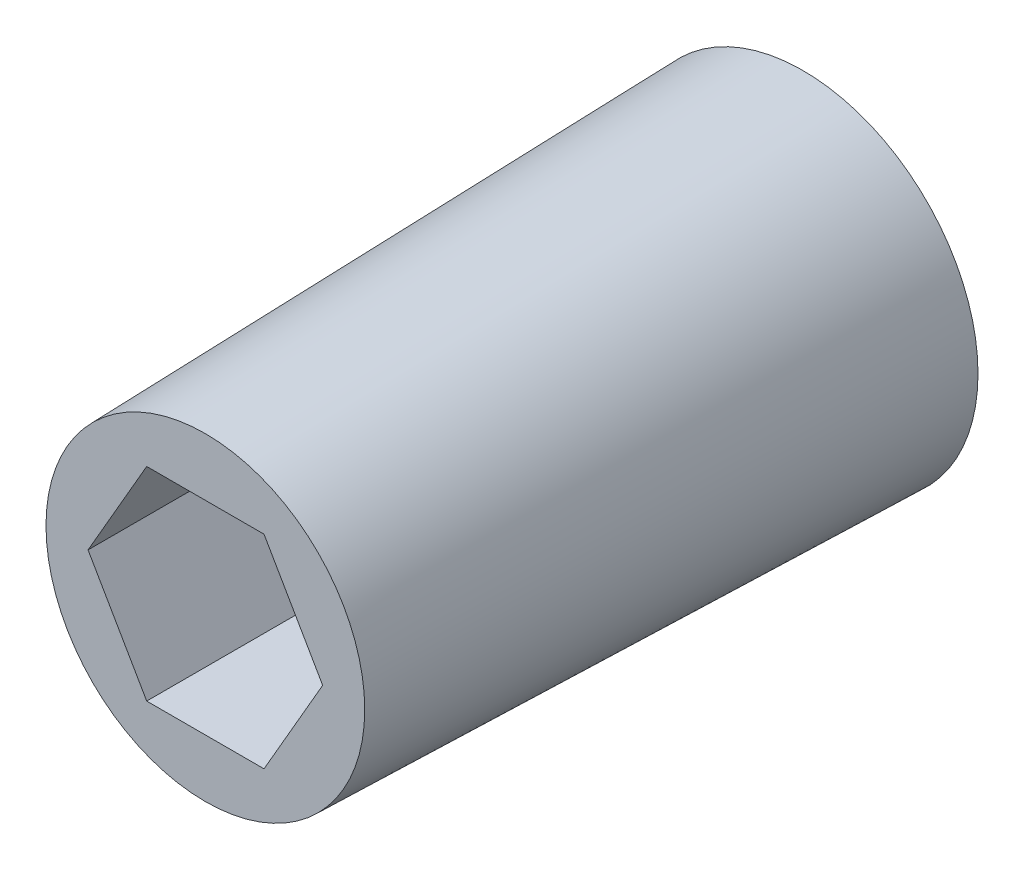
ISO-10303-21;
HEADER;
FILE_DESCRIPTION(('STEP AP214'),'2;1');
FILE_NAME('part.step','',(''),(''),'','','');
FILE_SCHEMA(('AUTOMOTIVE_DESIGN { 1 0 10303 214 1 1 1 1 }'));
ENDSEC;
DATA;
#1=APPLICATION_CONTEXT('core data for automotive mechanical design processes');
#2=APPLICATION_PROTOCOL_DEFINITION('international standard','automotive_design',2000,#1);
#3=PRODUCT_CONTEXT('',#1,'mechanical');
#4=PRODUCT('Part','Part','',(#3));
#5=PRODUCT_RELATED_PRODUCT_CATEGORY('part','',(#4));
#6=PRODUCT_DEFINITION_FORMATION('','',#4);
#7=PRODUCT_DEFINITION_CONTEXT('part definition',#1,'design');
#8=PRODUCT_DEFINITION('design','',#6,#7);
#9=PRODUCT_DEFINITION_SHAPE('','',#8);
#10=(LENGTH_UNIT() NAMED_UNIT(*) SI_UNIT(.MILLI.,.METRE.));
#11=(NAMED_UNIT(*) PLANE_ANGLE_UNIT() SI_UNIT($,.RADIAN.));
#12=(NAMED_UNIT(*) SI_UNIT($,.STERADIAN.) SOLID_ANGLE_UNIT());
#13=UNCERTAINTY_MEASURE_WITH_UNIT(LENGTH_MEASURE(1.E-05),#10,'distance_accuracy_value','');
#14=(GEOMETRIC_REPRESENTATION_CONTEXT(3) GLOBAL_UNCERTAINTY_ASSIGNED_CONTEXT((#13)) GLOBAL_UNIT_ASSIGNED_CONTEXT((#10,
#11,#12)) REPRESENTATION_CONTEXT('',''));
#15=CARTESIAN_POINT('',(0.,0.,0.));
#16=DIRECTION('',(0.,0.,1.));
#17=DIRECTION('',(1.,0.,0.));
#18=AXIS2_PLACEMENT_3D('',#15,#16,#17);
#19=CARTESIAN_POINT('',(0.,0.,7.5));
#20=DIRECTION('',(0.,0.,-1.));
#21=DIRECTION('',(-1.,0.,0.));
#22=AXIS2_PLACEMENT_3D('',#19,#20,#21);
#23=CONICAL_SURFACE('',#22,3.99999999999721,0.026179938749972);
#24=CARTESIAN_POINT('',(0.,0.,-7.5));
#25=DIRECTION('',(0.,0.,1.));
#26=DIRECTION('',(1.,0.,0.));
#27=AXIS2_PLACEMENT_3D('',#24,#25,#26);
#28=CIRCLE('',#27,4.39278882308556);
#29=CARTESIAN_POINT('',(4.39278882308556,0.,-7.5));
#30=VERTEX_POINT('',#29);
#31=EDGE_CURVE('E11',#30,#30,#28,.T.);
#32=ORIENTED_EDGE('',*,*,#31,.T.);
#33=EDGE_LOOP('',(#32));
#34=FACE_BOUND('',#33,.T.);
#35=CARTESIAN_POINT('',(0.,0.,7.5));
#36=DIRECTION('',(0.,0.,1.));
#37=DIRECTION('',(1.,0.,0.));
#38=AXIS2_PLACEMENT_3D('',#35,#36,#37);
#39=CIRCLE('',#38,3.99999999999721);
#40=CARTESIAN_POINT('',(3.99999999999721,0.,7.5));
#41=VERTEX_POINT('',#40);
#42=EDGE_CURVE('E40',#41,#41,#39,.T.);
#43=ORIENTED_EDGE('',*,*,#42,.F.);
#44=EDGE_LOOP('',(#43));
#45=FACE_BOUND('',#44,.T.);
#46=ADVANCED_FACE('F33',(#34,#45),#23,.T.);
#47=CARTESIAN_POINT('',(4.39278882308556,0.,-7.5));
#48=DIRECTION('',(0.,0.,-1.));
#49=DIRECTION('',(-1.,0.,0.));
#50=AXIS2_PLACEMENT_3D('',#47,#48,#49);
#51=PLANE('',#50);
#52=DIRECTION('',(0.5,-0.866025403784439,0.));
#53=VECTOR('',#52,1.);
#54=CARTESIAN_POINT('',(1.47224318643355,2.55,-7.5));
#55=LINE('',#54,#53);
#56=CARTESIAN_POINT('',(1.47224318643355,2.55,-7.5));
#57=VERTEX_POINT('',#56);
#58=CARTESIAN_POINT('',(2.94448637286709,0.,-7.5));
#59=VERTEX_POINT('',#58);
#60=EDGE_CURVE('E47',#57,#59,#55,.T.);
#61=ORIENTED_EDGE('',*,*,#60,.F.);
#62=DIRECTION('',(1.,0.,0.));
#63=VECTOR('',#62,1.);
#64=CARTESIAN_POINT('',(-1.47224318643355,2.55,-7.5));
#65=LINE('',#64,#63);
#66=CARTESIAN_POINT('',(-1.47224318643355,2.55,-7.5));
#67=VERTEX_POINT('',#66);
#68=EDGE_CURVE('E104',#67,#57,#65,.T.);
#69=ORIENTED_EDGE('',*,*,#68,.F.);
#70=DIRECTION('',(0.5,0.866025403784439,0.));
#71=VECTOR('',#70,1.);
#72=CARTESIAN_POINT('',(-2.94448637286709,0.,-7.5));
#73=LINE('',#72,#71);
#74=CARTESIAN_POINT('',(-2.94448637286709,0.,-7.5));
#75=VERTEX_POINT('',#74);
#76=EDGE_CURVE('E107',#75,#67,#73,.T.);
#77=ORIENTED_EDGE('',*,*,#76,.F.);
#78=DIRECTION('',(-0.5,0.866025403784439,0.));
#79=VECTOR('',#78,1.);
#80=CARTESIAN_POINT('',(-1.47224318643355,-2.55,-7.5));
#81=LINE('',#80,#79);
#82=CARTESIAN_POINT('',(-1.47224318643355,-2.55,-7.5));
#83=VERTEX_POINT('',#82);
#84=EDGE_CURVE('E123',#83,#75,#81,.T.);
#85=ORIENTED_EDGE('',*,*,#84,.F.);
#86=DIRECTION('',(-1.,0.,0.));
#87=VECTOR('',#86,1.);
#88=CARTESIAN_POINT('',(1.47224318643355,-2.55,-7.5));
#89=LINE('',#88,#87);
#90=CARTESIAN_POINT('',(1.47224318643355,-2.55,-7.5));
#91=VERTEX_POINT('',#90);
#92=EDGE_CURVE('E120',#91,#83,#89,.T.);
#93=ORIENTED_EDGE('',*,*,#92,.F.);
#94=DIRECTION('',(-0.5,-0.866025403784439,0.));
#95=VECTOR('',#94,1.);
#96=CARTESIAN_POINT('',(2.94448637286709,0.,-7.5));
#97=LINE('',#96,#95);
#98=EDGE_CURVE('E118',#59,#91,#97,.T.);
#99=ORIENTED_EDGE('',*,*,#98,.F.);
#100=EDGE_LOOP('',(#61,#69,#77,#85,#93,#99));
#101=FACE_BOUND('',#100,.T.);
#102=ORIENTED_EDGE('',*,*,#31,.F.);
#103=EDGE_LOOP('',(#102));
#104=FACE_BOUND('',#103,.T.);
#105=ADVANCED_FACE('F140',(#101,#104),#51,.T.);
#106=CARTESIAN_POINT('',(0.,0.,7.5));
#107=DIRECTION('',(0.,0.,1.));
#108=DIRECTION('',(1.,0.,0.));
#109=AXIS2_PLACEMENT_3D('',#106,#107,#108);
#110=PLANE('',#109);
#111=DIRECTION('',(0.5,-0.866025403784439,0.));
#112=VECTOR('',#111,1.);
#113=CARTESIAN_POINT('',(1.47224318643355,2.55,7.5));
#114=LINE('',#113,#112);
#115=CARTESIAN_POINT('',(1.47224318643355,2.55,7.5));
#116=VERTEX_POINT('',#115);
#117=CARTESIAN_POINT('',(2.94448637286709,0.,7.5));
#118=VERTEX_POINT('',#117);
#119=EDGE_CURVE('E87',#116,#118,#114,.T.);
#120=ORIENTED_EDGE('',*,*,#119,.T.);
#121=DIRECTION('',(-0.5,-0.866025403784439,0.));
#122=VECTOR('',#121,1.);
#123=CARTESIAN_POINT('',(2.94448637286709,0.,7.5));
#124=LINE('',#123,#122);
#125=CARTESIAN_POINT('',(1.47224318643355,-2.55,7.5));
#126=VERTEX_POINT('',#125);
#127=EDGE_CURVE('E96',#118,#126,#124,.T.);
#128=ORIENTED_EDGE('',*,*,#127,.T.);
#129=DIRECTION('',(-1.,0.,0.));
#130=VECTOR('',#129,1.);
#131=CARTESIAN_POINT('',(1.47224318643355,-2.55,7.5));
#132=LINE('',#131,#130);
#133=CARTESIAN_POINT('',(-1.47224318643355,-2.55,7.5));
#134=VERTEX_POINT('',#133);
#135=EDGE_CURVE('E55',#126,#134,#132,.T.);
#136=ORIENTED_EDGE('',*,*,#135,.T.);
#137=DIRECTION('',(-0.5,0.866025403784439,0.));
#138=VECTOR('',#137,1.);
#139=CARTESIAN_POINT('',(-1.47224318643355,-2.55,7.5));
#140=LINE('',#139,#138);
#141=CARTESIAN_POINT('',(-2.94448637286709,0.,7.5));
#142=VERTEX_POINT('',#141);
#143=EDGE_CURVE('E111',#134,#142,#140,.T.);
#144=ORIENTED_EDGE('',*,*,#143,.T.);
#145=DIRECTION('',(0.5,0.866025403784439,0.));
#146=VECTOR('',#145,1.);
#147=CARTESIAN_POINT('',(-2.94448637286709,0.,7.5));
#148=LINE('',#147,#146);
#149=CARTESIAN_POINT('',(-1.47224318643355,2.55,7.5));
#150=VERTEX_POINT('',#149);
#151=EDGE_CURVE('E114',#142,#150,#148,.T.);
#152=ORIENTED_EDGE('',*,*,#151,.T.);
#153=DIRECTION('',(1.,0.,0.));
#154=VECTOR('',#153,1.);
#155=CARTESIAN_POINT('',(-1.47224318643355,2.55,7.5));
#156=LINE('',#155,#154);
#157=EDGE_CURVE('E93',#150,#116,#156,.T.);
#158=ORIENTED_EDGE('',*,*,#157,.T.);
#159=EDGE_LOOP('',(#120,#128,#136,#144,#152,#158));
#160=FACE_BOUND('',#159,.T.);
#161=ORIENTED_EDGE('',*,*,#42,.T.);
#162=EDGE_LOOP('',(#161));
#163=FACE_BOUND('',#162,.T.);
#164=ADVANCED_FACE('F100',(#160,#163),#110,.T.);
#165=CARTESIAN_POINT('',(1.47224318643355,2.55,7.5));
#166=DIRECTION('',(0.866025403784439,0.5,0.));
#167=DIRECTION('',(-0.5,0.866025403784439,0.));
#168=AXIS2_PLACEMENT_3D('',#165,#166,#167);
#169=PLANE('',#168);
#170=ORIENTED_EDGE('',*,*,#60,.T.);
#171=DIRECTION('',(0.,0.,-1.));
#172=VECTOR('',#171,1.);
#173=CARTESIAN_POINT('',(2.94448637286709,0.,7.5));
#174=LINE('',#173,#172);
#175=EDGE_CURVE('E83',#118,#59,#174,.T.);
#176=ORIENTED_EDGE('',*,*,#175,.F.);
#177=ORIENTED_EDGE('',*,*,#119,.F.);
#178=DIRECTION('',(0.,0.,-1.));
#179=VECTOR('',#178,1.);
#180=CARTESIAN_POINT('',(1.47224318643355,2.55,7.5));
#181=LINE('',#180,#179);
#182=EDGE_CURVE('E128',#116,#57,#181,.T.);
#183=ORIENTED_EDGE('',*,*,#182,.T.);
#184=EDGE_LOOP('',(#170,#176,#177,#183));
#185=FACE_BOUND('',#184,.T.);
#186=ADVANCED_FACE('F85',(#185),#169,.F.);
#187=CARTESIAN_POINT('',(-1.47224318643355,2.55,7.5));
#188=DIRECTION('',(0.,1.,0.));
#189=DIRECTION('',(-1.,0.,0.));
#190=AXIS2_PLACEMENT_3D('',#187,#188,#189);
#191=PLANE('',#190);
#192=ORIENTED_EDGE('',*,*,#68,.T.);
#193=ORIENTED_EDGE('',*,*,#182,.F.);
#194=ORIENTED_EDGE('',*,*,#157,.F.);
#195=DIRECTION('',(0.,0.,-1.));
#196=VECTOR('',#195,1.);
#197=CARTESIAN_POINT('',(-1.47224318643355,2.55,7.5));
#198=LINE('',#197,#196);
#199=EDGE_CURVE('E130',#150,#67,#198,.T.);
#200=ORIENTED_EDGE('',*,*,#199,.T.);
#201=EDGE_LOOP('',(#192,#193,#194,#200));
#202=FACE_BOUND('',#201,.T.);
#203=ADVANCED_FACE('F155',(#202),#191,.F.);
#204=CARTESIAN_POINT('',(-2.94448637286709,0.,7.5));
#205=DIRECTION('',(-0.866025403784439,0.5,0.));
#206=DIRECTION('',(-0.5,-0.866025403784439,0.));
#207=AXIS2_PLACEMENT_3D('',#204,#205,#206);
#208=PLANE('',#207);
#209=ORIENTED_EDGE('',*,*,#76,.T.);
#210=ORIENTED_EDGE('',*,*,#199,.F.);
#211=ORIENTED_EDGE('',*,*,#151,.F.);
#212=DIRECTION('',(0.,0.,-1.));
#213=VECTOR('',#212,1.);
#214=CARTESIAN_POINT('',(-2.94448637286709,0.,7.5));
#215=LINE('',#214,#213);
#216=EDGE_CURVE('E132',#142,#75,#215,.T.);
#217=ORIENTED_EDGE('',*,*,#216,.T.);
#218=EDGE_LOOP('',(#209,#210,#211,#217));
#219=FACE_BOUND('',#218,.T.);
#220=ADVANCED_FACE('F164',(#219),#208,.F.);
#221=CARTESIAN_POINT('',(-1.47224318643355,-2.55,7.5));
#222=DIRECTION('',(-0.866025403784439,-0.5,0.));
#223=DIRECTION('',(0.5,-0.866025403784439,0.));
#224=AXIS2_PLACEMENT_3D('',#221,#222,#223);
#225=PLANE('',#224);
#226=ORIENTED_EDGE('',*,*,#84,.T.);
#227=ORIENTED_EDGE('',*,*,#216,.F.);
#228=ORIENTED_EDGE('',*,*,#143,.F.);
#229=DIRECTION('',(0.,0.,-1.));
#230=VECTOR('',#229,1.);
#231=CARTESIAN_POINT('',(-1.47224318643355,-2.55,7.5));
#232=LINE('',#231,#230);
#233=EDGE_CURVE('E134',#134,#83,#232,.T.);
#234=ORIENTED_EDGE('',*,*,#233,.T.);
#235=EDGE_LOOP('',(#226,#227,#228,#234));
#236=FACE_BOUND('',#235,.T.);
#237=ADVANCED_FACE('F161',(#236),#225,.F.);
#238=CARTESIAN_POINT('',(1.47224318643355,-2.55,7.5));
#239=DIRECTION('',(0.,-1.,0.));
#240=DIRECTION('',(1.,0.,0.));
#241=AXIS2_PLACEMENT_3D('',#238,#239,#240);
#242=PLANE('',#241);
#243=ORIENTED_EDGE('',*,*,#92,.T.);
#244=ORIENTED_EDGE('',*,*,#233,.F.);
#245=ORIENTED_EDGE('',*,*,#135,.F.);
#246=DIRECTION('',(0.,0.,-1.));
#247=VECTOR('',#246,1.);
#248=CARTESIAN_POINT('',(1.47224318643355,-2.55,7.5));
#249=LINE('',#248,#247);
#250=EDGE_CURVE('E92',#126,#91,#249,.T.);
#251=ORIENTED_EDGE('',*,*,#250,.T.);
#252=EDGE_LOOP('',(#243,#244,#245,#251));
#253=FACE_BOUND('',#252,.T.);
#254=ADVANCED_FACE('F158',(#253),#242,.F.);
#255=CARTESIAN_POINT('',(2.94448637286709,0.,7.5));
#256=DIRECTION('',(0.866025403784439,-0.5,0.));
#257=DIRECTION('',(0.5,0.866025403784439,0.));
#258=AXIS2_PLACEMENT_3D('',#255,#256,#257);
#259=PLANE('',#258);
#260=ORIENTED_EDGE('',*,*,#98,.T.);
#261=ORIENTED_EDGE('',*,*,#250,.F.);
#262=ORIENTED_EDGE('',*,*,#127,.F.);
#263=ORIENTED_EDGE('',*,*,#175,.T.);
#264=EDGE_LOOP('',(#260,#261,#262,#263));
#265=FACE_BOUND('',#264,.T.);
#266=ADVANCED_FACE('F97',(#265),#259,.F.);
#267=CLOSED_SHELL('',(#46,#105,#164,#186,#203,#220,#237,#254,#266));
#268=MANIFOLD_SOLID_BREP('B2',#267);
#269=ADVANCED_BREP_SHAPE_REPRESENTATION('',(#18,#268),#14);
#270=SHAPE_DEFINITION_REPRESENTATION(#9,#269);
ENDSEC;
END-ISO-10303-21;
